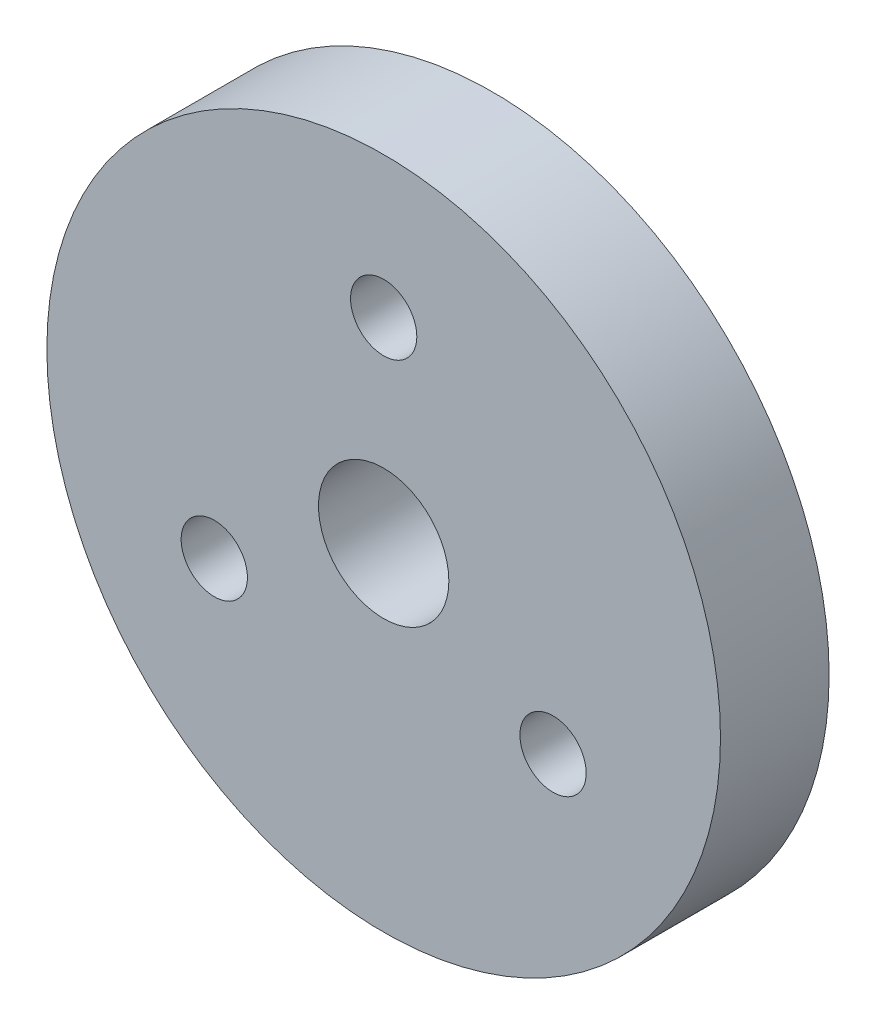
ISO-10303-21;
HEADER;
FILE_DESCRIPTION(('STEP AP214'),'2;1');
FILE_NAME('part.step','',(''),(''),'','','');
FILE_SCHEMA(('AUTOMOTIVE_DESIGN { 1 0 10303 214 1 1 1 1 }'));
ENDSEC;
DATA;
#1=APPLICATION_CONTEXT('core data for automotive mechanical design processes');
#2=APPLICATION_PROTOCOL_DEFINITION('international standard','automotive_design',2000,#1);
#3=PRODUCT_CONTEXT('',#1,'mechanical');
#4=PRODUCT('Part','Part','',(#3));
#5=PRODUCT_RELATED_PRODUCT_CATEGORY('part','',(#4));
#6=PRODUCT_DEFINITION_FORMATION('','',#4);
#7=PRODUCT_DEFINITION_CONTEXT('part definition',#1,'design');
#8=PRODUCT_DEFINITION('design','',#6,#7);
#9=PRODUCT_DEFINITION_SHAPE('','',#8);
#10=(LENGTH_UNIT() NAMED_UNIT(*) SI_UNIT(.MILLI.,.METRE.));
#11=(NAMED_UNIT(*) PLANE_ANGLE_UNIT() SI_UNIT($,.RADIAN.));
#12=(NAMED_UNIT(*) SI_UNIT($,.STERADIAN.) SOLID_ANGLE_UNIT());
#13=UNCERTAINTY_MEASURE_WITH_UNIT(LENGTH_MEASURE(1.E-05),#10,'distance_accuracy_value','');
#14=(GEOMETRIC_REPRESENTATION_CONTEXT(3) GLOBAL_UNCERTAINTY_ASSIGNED_CONTEXT((#13)) GLOBAL_UNIT_ASSIGNED_CONTEXT((#10,
#11,#12)) REPRESENTATION_CONTEXT('',''));
#15=CARTESIAN_POINT('',(0.,0.,0.));
#16=DIRECTION('',(0.,0.,1.));
#17=DIRECTION('',(1.,0.,0.));
#18=AXIS2_PLACEMENT_3D('',#15,#16,#17);
#19=CARTESIAN_POINT('',(0.,0.,5.));
#20=DIRECTION('',(0.,0.,-1.));
#21=DIRECTION('',(-1.,0.,0.));
#22=AXIS2_PLACEMENT_3D('',#19,#20,#21);
#23=CYLINDRICAL_SURFACE('',#22,15.5);
#24=CARTESIAN_POINT('',(0.,0.,5.));
#25=DIRECTION('',(0.,0.,1.));
#26=DIRECTION('',(1.,0.,0.));
#27=AXIS2_PLACEMENT_3D('',#24,#25,#26);
#28=CIRCLE('',#27,15.5);
#29=CARTESIAN_POINT('',(15.5,0.,5.));
#30=VERTEX_POINT('',#29);
#31=EDGE_CURVE('E10',#30,#30,#28,.T.);
#32=ORIENTED_EDGE('',*,*,#31,.F.);
#33=EDGE_LOOP('',(#32));
#34=FACE_BOUND('',#33,.T.);
#35=CARTESIAN_POINT('',(0.,0.,0.));
#36=DIRECTION('',(0.,0.,1.));
#37=DIRECTION('',(1.,0.,0.));
#38=AXIS2_PLACEMENT_3D('',#35,#36,#37);
#39=CIRCLE('',#38,15.5);
#40=CARTESIAN_POINT('',(15.5,0.,0.));
#41=VERTEX_POINT('',#40);
#42=EDGE_CURVE('E33',#41,#41,#39,.T.);
#43=ORIENTED_EDGE('',*,*,#42,.T.);
#44=EDGE_LOOP('',(#43));
#45=FACE_BOUND('',#44,.T.);
#46=ADVANCED_FACE('F30',(#34,#45),#23,.T.);
#47=CARTESIAN_POINT('',(0.,0.,5.));
#48=DIRECTION('',(0.,0.,1.));
#49=DIRECTION('',(1.,0.,0.));
#50=AXIS2_PLACEMENT_3D('',#47,#48,#49);
#51=PLANE('',#50);
#52=CARTESIAN_POINT('',(0.,8.9999999999999,5.));
#53=DIRECTION('',(0.,0.,1.));
#54=DIRECTION('',(1.,0.,0.));
#55=AXIS2_PLACEMENT_3D('',#52,#53,#54);
#56=CIRCLE('',#55,1.525);
#57=CARTESIAN_POINT('',(1.525,8.9999999999999,5.));
#58=VERTEX_POINT('',#57);
#59=EDGE_CURVE('E47',#58,#58,#56,.T.);
#60=ORIENTED_EDGE('',*,*,#59,.F.);
#61=EDGE_LOOP('',(#60));
#62=FACE_BOUND('',#61,.T.);
#63=CARTESIAN_POINT('',(7.79422863406053,-4.49999999999978,5.));
#64=DIRECTION('',(0.,0.,1.));
#65=DIRECTION('',(1.,0.,0.));
#66=AXIS2_PLACEMENT_3D('',#63,#64,#65);
#67=CIRCLE('',#66,1.52500000000049);
#68=CARTESIAN_POINT('',(9.31922863406103,-4.49999999999978,5.));
#69=VERTEX_POINT('',#68);
#70=EDGE_CURVE('E50',#69,#69,#67,.T.);
#71=ORIENTED_EDGE('',*,*,#70,.F.);
#72=EDGE_LOOP('',(#71));
#73=FACE_BOUND('',#72,.T.);
#74=CARTESIAN_POINT('',(-7.79422863405936,-4.50000000000034,5.));
#75=DIRECTION('',(0.,0.,1.));
#76=DIRECTION('',(1.,0.,0.));
#77=AXIS2_PLACEMENT_3D('',#74,#75,#76);
#78=CIRCLE('',#77,1.52500000000073);
#79=CARTESIAN_POINT('',(-6.26922863405863,-4.50000000000034,5.));
#80=VERTEX_POINT('',#79);
#81=EDGE_CURVE('E53',#80,#80,#78,.T.);
#82=ORIENTED_EDGE('',*,*,#81,.F.);
#83=EDGE_LOOP('',(#82));
#84=FACE_BOUND('',#83,.T.);
#85=CARTESIAN_POINT('',(0.,0.,5.));
#86=DIRECTION('',(0.,0.,1.));
#87=DIRECTION('',(1.,0.,0.));
#88=AXIS2_PLACEMENT_3D('',#85,#86,#87);
#89=CIRCLE('',#88,3.);
#90=CARTESIAN_POINT('',(3.,0.,5.));
#91=VERTEX_POINT('',#90);
#92=EDGE_CURVE('E44',#91,#91,#89,.T.);
#93=ORIENTED_EDGE('',*,*,#92,.F.);
#94=EDGE_LOOP('',(#93));
#95=FACE_BOUND('',#94,.T.);
#96=ORIENTED_EDGE('',*,*,#31,.T.);
#97=EDGE_LOOP('',(#96));
#98=FACE_BOUND('',#97,.T.);
#99=ADVANCED_FACE('F81',(#62,#73,#84,#95,#98),#51,.T.);
#100=CARTESIAN_POINT('',(0.,0.,0.));
#101=DIRECTION('',(0.,0.,1.));
#102=DIRECTION('',(1.,0.,0.));
#103=AXIS2_PLACEMENT_3D('',#100,#101,#102);
#104=PLANE('',#103);
#105=CARTESIAN_POINT('',(0.,8.9999999999999,0.));
#106=DIRECTION('',(0.,0.,1.));
#107=DIRECTION('',(1.,0.,0.));
#108=AXIS2_PLACEMENT_3D('',#105,#106,#107);
#109=CIRCLE('',#108,1.525);
#110=CARTESIAN_POINT('',(1.525,8.9999999999999,0.));
#111=VERTEX_POINT('',#110);
#112=EDGE_CURVE('E56',#111,#111,#109,.T.);
#113=ORIENTED_EDGE('',*,*,#112,.T.);
#114=EDGE_LOOP('',(#113));
#115=FACE_BOUND('',#114,.T.);
#116=CARTESIAN_POINT('',(7.79422863406053,-4.49999999999978,0.));
#117=DIRECTION('',(0.,0.,1.));
#118=DIRECTION('',(1.,0.,0.));
#119=AXIS2_PLACEMENT_3D('',#116,#117,#118);
#120=CIRCLE('',#119,1.52500000000049);
#121=CARTESIAN_POINT('',(9.31922863406103,-4.49999999999978,0.));
#122=VERTEX_POINT('',#121);
#123=EDGE_CURVE('E60',#122,#122,#120,.T.);
#124=ORIENTED_EDGE('',*,*,#123,.T.);
#125=EDGE_LOOP('',(#124));
#126=FACE_BOUND('',#125,.T.);
#127=CARTESIAN_POINT('',(-7.79422863405936,-4.50000000000034,0.));
#128=DIRECTION('',(0.,0.,1.));
#129=DIRECTION('',(1.,0.,0.));
#130=AXIS2_PLACEMENT_3D('',#127,#128,#129);
#131=CIRCLE('',#130,1.52500000000073);
#132=CARTESIAN_POINT('',(-6.26922863405863,-4.50000000000034,0.));
#133=VERTEX_POINT('',#132);
#134=EDGE_CURVE('E57',#133,#133,#131,.T.);
#135=ORIENTED_EDGE('',*,*,#134,.T.);
#136=EDGE_LOOP('',(#135));
#137=FACE_BOUND('',#136,.T.);
#138=CARTESIAN_POINT('',(0.,0.,0.));
#139=DIRECTION('',(0.,0.,1.));
#140=DIRECTION('',(1.,0.,0.));
#141=AXIS2_PLACEMENT_3D('',#138,#139,#140);
#142=CIRCLE('',#141,3.);
#143=CARTESIAN_POINT('',(3.,0.,0.));
#144=VERTEX_POINT('',#143);
#145=EDGE_CURVE('E40',#144,#144,#142,.F.);
#146=ORIENTED_EDGE('',*,*,#145,.F.);
#147=EDGE_LOOP('',(#146));
#148=FACE_BOUND('',#147,.T.);
#149=ORIENTED_EDGE('',*,*,#42,.F.);
#150=EDGE_LOOP('',(#149));
#151=FACE_BOUND('',#150,.T.);
#152=ADVANCED_FACE('F66',(#115,#126,#137,#148,#151),#104,.F.);
#153=CARTESIAN_POINT('',(0.,0.,-0.000999999999973245));
#154=DIRECTION('',(0.,0.,1.));
#155=DIRECTION('',(1.,0.,0.));
#156=AXIS2_PLACEMENT_3D('',#153,#154,#155);
#157=CYLINDRICAL_SURFACE('',#156,3.);
#158=ORIENTED_EDGE('',*,*,#92,.T.);
#159=EDGE_LOOP('',(#158));
#160=FACE_BOUND('',#159,.T.);
#161=ORIENTED_EDGE('',*,*,#145,.T.);
#162=EDGE_LOOP('',(#161));
#163=FACE_BOUND('',#162,.T.);
#164=ADVANCED_FACE('F92',(#160,#163),#157,.F.);
#165=CARTESIAN_POINT('',(-7.79422863405936,-4.50000000000034,0.));
#166=DIRECTION('',(0.,0.,1.));
#167=DIRECTION('',(1.,0.,0.));
#168=AXIS2_PLACEMENT_3D('',#165,#166,#167);
#169=CYLINDRICAL_SURFACE('',#168,1.52500000000073);
#170=ORIENTED_EDGE('',*,*,#81,.T.);
#171=EDGE_LOOP('',(#170));
#172=FACE_BOUND('',#171,.T.);
#173=ORIENTED_EDGE('',*,*,#134,.F.);
#174=EDGE_LOOP('',(#173));
#175=FACE_BOUND('',#174,.T.);
#176=ADVANCED_FACE('F77',(#172,#175),#169,.F.);
#177=CARTESIAN_POINT('',(7.79422863406053,-4.49999999999978,0.));
#178=DIRECTION('',(0.,0.,1.));
#179=DIRECTION('',(1.,0.,0.));
#180=AXIS2_PLACEMENT_3D('',#177,#178,#179);
#181=CYLINDRICAL_SURFACE('',#180,1.52500000000049);
#182=ORIENTED_EDGE('',*,*,#70,.T.);
#183=EDGE_LOOP('',(#182));
#184=FACE_BOUND('',#183,.T.);
#185=ORIENTED_EDGE('',*,*,#123,.F.);
#186=EDGE_LOOP('',(#185));
#187=FACE_BOUND('',#186,.T.);
#188=ADVANCED_FACE('F71',(#184,#187),#181,.F.);
#189=CARTESIAN_POINT('',(0.,8.9999999999999,0.));
#190=DIRECTION('',(0.,0.,1.));
#191=DIRECTION('',(1.,0.,0.));
#192=AXIS2_PLACEMENT_3D('',#189,#190,#191);
#193=CYLINDRICAL_SURFACE('',#192,1.525);
#194=ORIENTED_EDGE('',*,*,#59,.T.);
#195=EDGE_LOOP('',(#194));
#196=FACE_BOUND('',#195,.T.);
#197=ORIENTED_EDGE('',*,*,#112,.F.);
#198=EDGE_LOOP('',(#197));
#199=FACE_BOUND('',#198,.T.);
#200=ADVANCED_FACE('F69',(#196,#199),#193,.F.);
#201=CLOSED_SHELL('',(#46,#99,#152,#164,#176,#188,#200));
#202=MANIFOLD_SOLID_BREP('B2',#201);
#203=ADVANCED_BREP_SHAPE_REPRESENTATION('',(#18,#202),#14);
#204=SHAPE_DEFINITION_REPRESENTATION(#9,#203);
ENDSEC;
END-ISO-10303-21;
